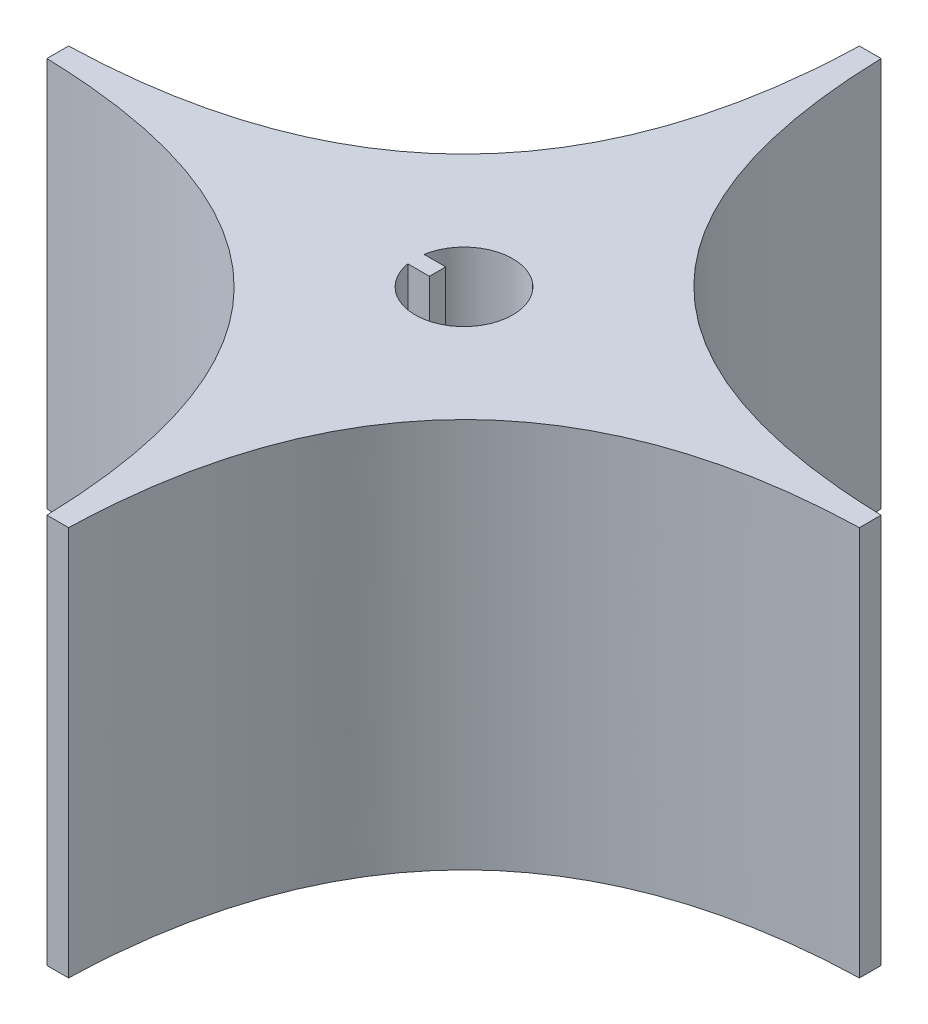
ISO-10303-21;
HEADER;
FILE_DESCRIPTION(('STEP AP214'),'2;1');
FILE_NAME('part.step','',(''),(''),'','','');
FILE_SCHEMA(('AUTOMOTIVE_DESIGN { 1 0 10303 214 1 1 1 1 }'));
ENDSEC;
DATA;
#1=APPLICATION_CONTEXT('core data for automotive mechanical design processes');
#2=APPLICATION_PROTOCOL_DEFINITION('international standard','automotive_design',2000,#1);
#3=PRODUCT_CONTEXT('',#1,'mechanical');
#4=PRODUCT('Part','Part','',(#3));
#5=PRODUCT_RELATED_PRODUCT_CATEGORY('part','',(#4));
#6=PRODUCT_DEFINITION_FORMATION('','',#4);
#7=PRODUCT_DEFINITION_CONTEXT('part definition',#1,'design');
#8=PRODUCT_DEFINITION('design','',#6,#7);
#9=PRODUCT_DEFINITION_SHAPE('','',#8);
#10=(LENGTH_UNIT() NAMED_UNIT(*) SI_UNIT(.MILLI.,.METRE.));
#11=(NAMED_UNIT(*) PLANE_ANGLE_UNIT() SI_UNIT($,.RADIAN.));
#12=(NAMED_UNIT(*) SI_UNIT($,.STERADIAN.) SOLID_ANGLE_UNIT());
#13=UNCERTAINTY_MEASURE_WITH_UNIT(LENGTH_MEASURE(1.E-05),#10,'distance_accuracy_value','');
#14=(GEOMETRIC_REPRESENTATION_CONTEXT(3) GLOBAL_UNCERTAINTY_ASSIGNED_CONTEXT((#13)) GLOBAL_UNIT_ASSIGNED_CONTEXT((#10,
#11,#12)) REPRESENTATION_CONTEXT('',''));
#15=CARTESIAN_POINT('',(0.,0.,0.));
#16=DIRECTION('',(0.,0.,1.));
#17=DIRECTION('',(1.,0.,0.));
#18=AXIS2_PLACEMENT_3D('',#15,#16,#17);
#19=CARTESIAN_POINT('',(0.,-18.,0.));
#20=DIRECTION('',(0.,-1.,0.));
#21=DIRECTION('',(0.,0.,-1.));
#22=AXIS2_PLACEMENT_3D('',#19,#20,#21);
#23=PLANE('',#22);
#24=CARTESIAN_POINT('',(0.,-18.,1.));
#25=DIRECTION('',(0.,-1.,0.));
#26=DIRECTION('',(0.,0.,-1.));
#27=AXIS2_PLACEMENT_3D('',#24,#25,#26);
#28=CIRCLE('',#27,4.50000000000001);
#29=CARTESIAN_POINT('',(-4.43738740323876,-18.,0.251940487943627));
#30=VERTEX_POINT('',#29);
#31=CARTESIAN_POINT('',(-4.43673139851751,-18.,1.75194048794363));
#32=VERTEX_POINT('',#31);
#33=EDGE_CURVE('E49',#30,#32,#28,.T.);
#34=ORIENTED_EDGE('',*,*,#33,.F.);
#35=DIRECTION('',(-1.,0.,0.));
#36=VECTOR('',#35,1.);
#37=CARTESIAN_POINT('',(-4.43738740323876,-18.,0.251940487943627));
#38=LINE('',#37,#36);
#39=CARTESIAN_POINT('',(-2.43673139851751,-18.,0.251940487943627));
#40=VERTEX_POINT('',#39);
#41=EDGE_CURVE('E235',#40,#30,#38,.T.);
#42=ORIENTED_EDGE('',*,*,#41,.F.);
#43=DIRECTION('',(0.,0.,-1.));
#44=VECTOR('',#43,1.);
#45=CARTESIAN_POINT('',(-2.43673139851751,-18.,1.75194048794363));
#46=LINE('',#45,#44);
#47=CARTESIAN_POINT('',(-2.43673139851751,-18.,1.75194048794363));
#48=VERTEX_POINT('',#47);
#49=EDGE_CURVE('E249',#48,#40,#46,.T.);
#50=ORIENTED_EDGE('',*,*,#49,.F.);
#51=DIRECTION('',(1.,0.,0.));
#52=VECTOR('',#51,1.);
#53=CARTESIAN_POINT('',(-4.43673139851751,-18.,1.75194048794363));
#54=LINE('',#53,#52);
#55=EDGE_CURVE('E246',#32,#48,#54,.T.);
#56=ORIENTED_EDGE('',*,*,#55,.F.);
#57=EDGE_LOOP('',(#34,#42,#50,#56));
#58=FACE_BOUND('',#57,.T.);
#59=DIRECTION('',(0.,0.,-1.));
#60=VECTOR('',#59,1.);
#61=CARTESIAN_POINT('',(37.5,-18.,2.));
#62=LINE('',#61,#60);
#63=CARTESIAN_POINT('',(37.5,-18.,2.));
#64=VERTEX_POINT('',#63);
#65=CARTESIAN_POINT('',(37.5,-18.,0.));
#66=VERTEX_POINT('',#65);
#67=EDGE_CURVE('E264',#64,#66,#62,.T.);
#68=ORIENTED_EDGE('',*,*,#67,.F.);
#69=CARTESIAN_POINT('',(37.5,-18.,2.));
#70=CARTESIAN_POINT('',(1.96320343559642,-18.,2.96320343559642));
#71=CARTESIAN_POINT('',(1.,-18.,38.5));
#72=B_SPLINE_CURVE_WITH_KNOTS('',2,(#69,#70,#71),.UNSPECIFIED.,.F.,.F.,(3,3),(0.,1.),.UNSPECIFIED.);
#73=CARTESIAN_POINT('',(1.,-18.,38.5));
#74=VERTEX_POINT('',#73);
#75=EDGE_CURVE('E11',#64,#74,#72,.T.);
#76=ORIENTED_EDGE('',*,*,#75,.T.);
#77=DIRECTION('',(1.,0.,0.));
#78=VECTOR('',#77,1.);
#79=CARTESIAN_POINT('',(-1.,-18.,38.5));
#80=LINE('',#79,#78);
#81=CARTESIAN_POINT('',(-1.,-18.,38.5));
#82=VERTEX_POINT('',#81);
#83=EDGE_CURVE('E278',#82,#74,#80,.T.);
#84=ORIENTED_EDGE('',*,*,#83,.F.);
#85=CARTESIAN_POINT('',(-1.,-18.,38.5));
#86=CARTESIAN_POINT('',(-1.96320343559643,-18.,2.96320343559643));
#87=CARTESIAN_POINT('',(-37.5,-18.,2.));
#88=B_SPLINE_CURVE_WITH_KNOTS('',2,(#85,#86,#87),.UNSPECIFIED.,.F.,.F.,(3,3),(0.,1.),.UNSPECIFIED.);
#89=CARTESIAN_POINT('',(-37.5,-18.,2.));
#90=VERTEX_POINT('',#89);
#91=EDGE_CURVE('E285',#82,#90,#88,.T.);
#92=ORIENTED_EDGE('',*,*,#91,.T.);
#93=DIRECTION('',(0.,0.,-1.));
#94=VECTOR('',#93,1.);
#95=CARTESIAN_POINT('',(-37.5,-18.,2.));
#96=LINE('',#95,#94);
#97=CARTESIAN_POINT('',(-37.5,-18.,0.));
#98=VERTEX_POINT('',#97);
#99=EDGE_CURVE('E256',#90,#98,#96,.T.);
#100=ORIENTED_EDGE('',*,*,#99,.T.);
#101=CARTESIAN_POINT('',(-37.5,-18.,0.));
#102=CARTESIAN_POINT('',(-1.96320343559643,-18.,-0.963203435596428));
#103=CARTESIAN_POINT('',(-1.,-18.,-36.5));
#104=B_SPLINE_CURVE_WITH_KNOTS('',2,(#101,#102,#103),.UNSPECIFIED.,.F.,.F.,(3,3),(0.,1.),.UNSPECIFIED.);
#105=CARTESIAN_POINT('',(-1.,-18.,-36.5));
#106=VERTEX_POINT('',#105);
#107=EDGE_CURVE('E290',#98,#106,#104,.T.);
#108=ORIENTED_EDGE('',*,*,#107,.T.);
#109=DIRECTION('',(1.,0.,0.));
#110=VECTOR('',#109,1.);
#111=CARTESIAN_POINT('',(-1.,-18.,-36.5));
#112=LINE('',#111,#110);
#113=CARTESIAN_POINT('',(1.,-18.,-36.5));
#114=VERTEX_POINT('',#113);
#115=EDGE_CURVE('E283',#106,#114,#112,.T.);
#116=ORIENTED_EDGE('',*,*,#115,.T.);
#117=CARTESIAN_POINT('',(1.,-18.,-36.5));
#118=CARTESIAN_POINT('',(1.96320343559642,-18.,-0.96320343559642));
#119=CARTESIAN_POINT('',(37.5,-18.,0.));
#120=B_SPLINE_CURVE_WITH_KNOTS('',2,(#117,#118,#119),.UNSPECIFIED.,.F.,.F.,(3,3),(0.,1.),.UNSPECIFIED.);
#121=EDGE_CURVE('E42',#114,#66,#120,.T.);
#122=ORIENTED_EDGE('',*,*,#121,.T.);
#123=EDGE_LOOP('',(#68,#76,#84,#92,#100,#108,#116,#122));
#124=FACE_BOUND('',#123,.T.);
#125=ADVANCED_FACE('F32',(#58,#124),#23,.T.);
#126=CARTESIAN_POINT('',(37.5,18.,2.));
#127=DIRECTION('',(-1.,0.,0.));
#128=DIRECTION('',(0.,-1.,0.));
#129=AXIS2_PLACEMENT_3D('',#126,#127,#128);
#130=PLANE('',#129);
#131=DIRECTION('',(0.,1.,0.));
#132=VECTOR('',#131,1.);
#133=CARTESIAN_POINT('',(37.5,18.,0.));
#134=LINE('',#133,#132);
#135=CARTESIAN_POINT('',(37.5,18.,0.));
#136=VERTEX_POINT('',#135);
#137=EDGE_CURVE('E269',#66,#136,#134,.T.);
#138=ORIENTED_EDGE('',*,*,#137,.T.);
#139=DIRECTION('',(0.,0.,-1.));
#140=VECTOR('',#139,1.);
#141=CARTESIAN_POINT('',(37.5,18.,2.));
#142=LINE('',#141,#140);
#143=CARTESIAN_POINT('',(37.5,18.,2.));
#144=VERTEX_POINT('',#143);
#145=EDGE_CURVE('E191',#144,#136,#142,.T.);
#146=ORIENTED_EDGE('',*,*,#145,.F.);
#147=DIRECTION('',(0.,1.,0.));
#148=VECTOR('',#147,1.);
#149=CARTESIAN_POINT('',(37.5,18.,2.));
#150=LINE('',#149,#148);
#151=EDGE_CURVE('E270',#64,#144,#150,.T.);
#152=ORIENTED_EDGE('',*,*,#151,.F.);
#153=ORIENTED_EDGE('',*,*,#67,.T.);
#154=EDGE_LOOP('',(#138,#146,#152,#153));
#155=FACE_BOUND('',#154,.T.);
#156=ADVANCED_FACE('F359',(#155),#130,.F.);
#157=CARTESIAN_POINT('',(-37.5,18.,2.));
#158=DIRECTION('',(1.,0.,0.));
#159=DIRECTION('',(0.,1.,0.));
#160=AXIS2_PLACEMENT_3D('',#157,#158,#159);
#161=PLANE('',#160);
#162=DIRECTION('',(0.,-1.,0.));
#163=VECTOR('',#162,1.);
#164=CARTESIAN_POINT('',(-37.5,18.,2.));
#165=LINE('',#164,#163);
#166=CARTESIAN_POINT('',(-37.5,18.,2.));
#167=VERTEX_POINT('',#166);
#168=EDGE_CURVE('E266',#167,#90,#165,.T.);
#169=ORIENTED_EDGE('',*,*,#168,.F.);
#170=DIRECTION('',(0.,0.,-1.));
#171=VECTOR('',#170,1.);
#172=CARTESIAN_POINT('',(-37.5,18.,2.));
#173=LINE('',#172,#171);
#174=CARTESIAN_POINT('',(-37.5,18.,0.));
#175=VERTEX_POINT('',#174);
#176=EDGE_CURVE('E185',#167,#175,#173,.T.);
#177=ORIENTED_EDGE('',*,*,#176,.T.);
#178=DIRECTION('',(0.,-1.,0.));
#179=VECTOR('',#178,1.);
#180=CARTESIAN_POINT('',(-37.5,18.,0.));
#181=LINE('',#180,#179);
#182=EDGE_CURVE('E267',#175,#98,#181,.T.);
#183=ORIENTED_EDGE('',*,*,#182,.T.);
#184=ORIENTED_EDGE('',*,*,#99,.F.);
#185=EDGE_LOOP('',(#169,#177,#183,#184));
#186=FACE_BOUND('',#185,.T.);
#187=ADVANCED_FACE('F372',(#186),#161,.F.);
#188=CARTESIAN_POINT('',(0.,0.,-36.5));
#189=DIRECTION('',(0.,0.,1.));
#190=DIRECTION('',(1.,0.,0.));
#191=AXIS2_PLACEMENT_3D('',#188,#189,#190);
#192=PLANE('',#191);
#193=DIRECTION('',(0.,1.,0.));
#194=VECTOR('',#193,1.);
#195=CARTESIAN_POINT('',(-1.,-18.,-36.5));
#196=LINE('',#195,#194);
#197=CARTESIAN_POINT('',(-1.00000000000001,18.,-36.5));
#198=VERTEX_POINT('',#197);
#199=EDGE_CURVE('E280',#106,#198,#196,.T.);
#200=ORIENTED_EDGE('',*,*,#199,.T.);
#201=DIRECTION('',(1.,0.,0.));
#202=VECTOR('',#201,1.);
#203=CARTESIAN_POINT('',(-1.00000000000001,18.,-36.5));
#204=LINE('',#203,#202);
#205=CARTESIAN_POINT('',(0.999999999999986,18.,-36.5));
#206=VERTEX_POINT('',#205);
#207=EDGE_CURVE('E197',#198,#206,#204,.T.);
#208=ORIENTED_EDGE('',*,*,#207,.T.);
#209=DIRECTION('',(0.,1.,0.));
#210=VECTOR('',#209,1.);
#211=CARTESIAN_POINT('',(1.,-18.,-36.5));
#212=LINE('',#211,#210);
#213=EDGE_CURVE('E57',#114,#206,#212,.T.);
#214=ORIENTED_EDGE('',*,*,#213,.F.);
#215=ORIENTED_EDGE('',*,*,#115,.F.);
#216=EDGE_LOOP('',(#200,#208,#214,#215));
#217=FACE_BOUND('',#216,.T.);
#218=ADVANCED_FACE('F312',(#217),#192,.F.);
#219=CARTESIAN_POINT('',(0.,0.,38.5));
#220=DIRECTION('',(0.,0.,1.));
#221=DIRECTION('',(1.,0.,0.));
#222=AXIS2_PLACEMENT_3D('',#219,#220,#221);
#223=PLANE('',#222);
#224=DIRECTION('',(0.,1.,0.));
#225=VECTOR('',#224,1.);
#226=CARTESIAN_POINT('',(1.,-18.,38.5));
#227=LINE('',#226,#225);
#228=CARTESIAN_POINT('',(0.999999999999986,18.,38.5));
#229=VERTEX_POINT('',#228);
#230=EDGE_CURVE('E276',#74,#229,#227,.T.);
#231=ORIENTED_EDGE('',*,*,#230,.T.);
#232=DIRECTION('',(1.,0.,0.));
#233=VECTOR('',#232,1.);
#234=CARTESIAN_POINT('',(-1.00000000000001,18.,38.5));
#235=LINE('',#234,#233);
#236=CARTESIAN_POINT('',(-1.00000000000001,18.,38.5));
#237=VERTEX_POINT('',#236);
#238=EDGE_CURVE('E194',#237,#229,#235,.T.);
#239=ORIENTED_EDGE('',*,*,#238,.F.);
#240=DIRECTION('',(0.,1.,0.));
#241=VECTOR('',#240,1.);
#242=CARTESIAN_POINT('',(-1.,-18.,38.5));
#243=LINE('',#242,#241);
#244=EDGE_CURVE('E272',#82,#237,#243,.T.);
#245=ORIENTED_EDGE('',*,*,#244,.F.);
#246=ORIENTED_EDGE('',*,*,#83,.T.);
#247=EDGE_LOOP('',(#231,#239,#245,#246));
#248=FACE_BOUND('',#247,.T.);
#249=ADVANCED_FACE('F310',(#248),#223,.T.);
#250=CARTESIAN_POINT('',(-1.,18.,38.5));
#251=CARTESIAN_POINT('',(-1.96320343559643,18.,2.96320343559643));
#252=CARTESIAN_POINT('',(-37.5,18.,2.));
#253=B_SPLINE_CURVE_WITH_KNOTS('',2,(#250,#251,#252),.UNSPECIFIED.,.F.,.F.,(3,3),(0.,1.),.UNSPECIFIED.);
#254=DIRECTION('',(0.,-1.,0.));
#255=VECTOR('',#254,1.);
#256=SURFACE_OF_LINEAR_EXTRUSION('',#253,#255);
#257=ORIENTED_EDGE('',*,*,#244,.T.);
#258=CARTESIAN_POINT('',(-1.00000000000001,18.,38.5));
#259=CARTESIAN_POINT('',(-1.96320343559644,18.,2.96320343559643));
#260=CARTESIAN_POINT('',(-37.5,18.,2.));
#261=B_SPLINE_CURVE_WITH_KNOTS('',2,(#258,#259,#260),.UNSPECIFIED.,.F.,.F.,(3,3),(0.,1.),.UNSPECIFIED.);
#262=EDGE_CURVE('E199',#237,#167,#261,.T.);
#263=ORIENTED_EDGE('',*,*,#262,.T.);
#264=ORIENTED_EDGE('',*,*,#168,.T.);
#265=ORIENTED_EDGE('',*,*,#91,.F.);
#266=EDGE_LOOP('',(#257,#263,#264,#265));
#267=FACE_BOUND('',#266,.T.);
#268=ADVANCED_FACE('F305',(#267),#256,.T.);
#269=CARTESIAN_POINT('',(-37.5,18.,0.));
#270=CARTESIAN_POINT('',(-1.96320343559643,18.,-0.963203435596428));
#271=CARTESIAN_POINT('',(-1.,18.,-36.5));
#272=B_SPLINE_CURVE_WITH_KNOTS('',2,(#269,#270,#271),.UNSPECIFIED.,.F.,.F.,(3,3),(0.,1.),.UNSPECIFIED.);
#273=DIRECTION('',(0.,-1.,0.));
#274=VECTOR('',#273,1.);
#275=SURFACE_OF_LINEAR_EXTRUSION('',#272,#274);
#276=ORIENTED_EDGE('',*,*,#182,.F.);
#277=CARTESIAN_POINT('',(-37.5,18.,0.));
#278=CARTESIAN_POINT('',(-1.96320343559644,18.,-0.963203435596428));
#279=CARTESIAN_POINT('',(-1.00000000000001,18.,-36.5));
#280=B_SPLINE_CURVE_WITH_KNOTS('',2,(#277,#278,#279),.UNSPECIFIED.,.F.,.F.,(3,3),(0.,1.),.UNSPECIFIED.);
#281=EDGE_CURVE('E204',#175,#198,#280,.T.);
#282=ORIENTED_EDGE('',*,*,#281,.T.);
#283=ORIENTED_EDGE('',*,*,#199,.F.);
#284=ORIENTED_EDGE('',*,*,#107,.F.);
#285=EDGE_LOOP('',(#276,#282,#283,#284));
#286=FACE_BOUND('',#285,.T.);
#287=ADVANCED_FACE('F309',(#286),#275,.T.);
#288=CARTESIAN_POINT('',(1.,18.,-36.5));
#289=CARTESIAN_POINT('',(1.96320343559642,18.,-0.96320343559642));
#290=CARTESIAN_POINT('',(37.5,18.,0.));
#291=B_SPLINE_CURVE_WITH_KNOTS('',2,(#288,#289,#290),.UNSPECIFIED.,.F.,.F.,(3,3),(0.,1.),.UNSPECIFIED.);
#292=DIRECTION('',(0.,-1.,0.));
#293=VECTOR('',#292,1.);
#294=SURFACE_OF_LINEAR_EXTRUSION('',#291,#293);
#295=ORIENTED_EDGE('',*,*,#213,.T.);
#296=CARTESIAN_POINT('',(0.999999999999986,18.,-36.5));
#297=CARTESIAN_POINT('',(1.96320343559641,18.,-0.96320343559642));
#298=CARTESIAN_POINT('',(37.5,18.,0.));
#299=B_SPLINE_CURVE_WITH_KNOTS('',2,(#296,#297,#298),.UNSPECIFIED.,.F.,.F.,(3,3),(0.,1.),.UNSPECIFIED.);
#300=EDGE_CURVE('E212',#206,#136,#299,.T.);
#301=ORIENTED_EDGE('',*,*,#300,.T.);
#302=ORIENTED_EDGE('',*,*,#137,.F.);
#303=ORIENTED_EDGE('',*,*,#121,.F.);
#304=EDGE_LOOP('',(#295,#301,#302,#303));
#305=FACE_BOUND('',#304,.T.);
#306=ADVANCED_FACE('F316',(#305),#294,.T.);
#307=CARTESIAN_POINT('',(37.5,18.,2.));
#308=CARTESIAN_POINT('',(1.96320343559642,18.,2.96320343559642));
#309=CARTESIAN_POINT('',(1.,18.,38.5));
#310=B_SPLINE_CURVE_WITH_KNOTS('',2,(#307,#308,#309),.UNSPECIFIED.,.F.,.F.,(3,3),(0.,1.),.UNSPECIFIED.);
#311=DIRECTION('',(0.,-1.,0.));
#312=VECTOR('',#311,1.);
#313=SURFACE_OF_LINEAR_EXTRUSION('',#310,#312);
#314=ORIENTED_EDGE('',*,*,#151,.T.);
#315=CARTESIAN_POINT('',(37.5,18.,2.));
#316=CARTESIAN_POINT('',(1.96320343559641,18.,2.96320343559642));
#317=CARTESIAN_POINT('',(0.999999999999986,18.,38.5));
#318=B_SPLINE_CURVE_WITH_KNOTS('',2,(#315,#316,#317),.UNSPECIFIED.,.F.,.F.,(3,3),(0.,1.),.UNSPECIFIED.);
#319=EDGE_CURVE('E220',#144,#229,#318,.T.);
#320=ORIENTED_EDGE('',*,*,#319,.T.);
#321=ORIENTED_EDGE('',*,*,#230,.F.);
#322=ORIENTED_EDGE('',*,*,#75,.F.);
#323=EDGE_LOOP('',(#314,#320,#321,#322));
#324=FACE_BOUND('',#323,.T.);
#325=ADVANCED_FACE('F365',(#324),#313,.T.);
#326=CARTESIAN_POINT('',(0.,-8.,1.));
#327=DIRECTION('',(0.,-1.,0.));
#328=DIRECTION('',(0.,0.,-1.));
#329=AXIS2_PLACEMENT_3D('',#326,#327,#328);
#330=CYLINDRICAL_SURFACE('',#329,4.50000000000001);
#331=ORIENTED_EDGE('',*,*,#33,.T.);
#332=DIRECTION('',(0.,-1.,0.));
#333=VECTOR('',#332,1.);
#334=CARTESIAN_POINT('',(-4.43673139851751,-8.,1.75194048794363));
#335=LINE('',#334,#333);
#336=CARTESIAN_POINT('',(-4.43673139851751,-8.,1.75194048794363));
#337=VERTEX_POINT('',#336);
#338=EDGE_CURVE('E244',#337,#32,#335,.T.);
#339=ORIENTED_EDGE('',*,*,#338,.F.);
#340=CARTESIAN_POINT('',(0.,-8.,1.));
#341=DIRECTION('',(0.,-1.,0.));
#342=DIRECTION('',(0.,0.,-1.));
#343=AXIS2_PLACEMENT_3D('',#340,#341,#342);
#344=CIRCLE('',#343,4.50000000000001);
#345=CARTESIAN_POINT('',(-4.43738740323876,-8.,0.251940487943627));
#346=VERTEX_POINT('',#345);
#347=EDGE_CURVE('E228',#346,#337,#344,.T.);
#348=ORIENTED_EDGE('',*,*,#347,.F.);
#349=DIRECTION('',(0.,-1.,0.));
#350=VECTOR('',#349,1.);
#351=CARTESIAN_POINT('',(-4.43738740323876,-8.,0.251940487943627));
#352=LINE('',#351,#350);
#353=EDGE_CURVE('E254',#346,#30,#352,.T.);
#354=ORIENTED_EDGE('',*,*,#353,.T.);
#355=EDGE_LOOP('',(#331,#339,#348,#354));
#356=FACE_BOUND('',#355,.T.);
#357=ADVANCED_FACE('F405',(#356),#330,.F.);
#358=CARTESIAN_POINT('',(-4.43738740323876,-8.,0.251940487943627));
#359=DIRECTION('',(0.,0.,1.));
#360=DIRECTION('',(1.,0.,0.));
#361=AXIS2_PLACEMENT_3D('',#358,#359,#360);
#362=PLANE('',#361);
#363=ORIENTED_EDGE('',*,*,#41,.T.);
#364=ORIENTED_EDGE('',*,*,#353,.F.);
#365=DIRECTION('',(-1.,0.,0.));
#366=VECTOR('',#365,1.);
#367=CARTESIAN_POINT('',(-4.43738740323876,-8.,0.251940487943627));
#368=LINE('',#367,#366);
#369=CARTESIAN_POINT('',(-2.43673139851751,-8.,0.251940487943627));
#370=VERTEX_POINT('',#369);
#371=EDGE_CURVE('E241',#370,#346,#368,.T.);
#372=ORIENTED_EDGE('',*,*,#371,.F.);
#373=DIRECTION('',(0.,-1.,0.));
#374=VECTOR('',#373,1.);
#375=CARTESIAN_POINT('',(-2.43673139851751,-8.,0.251940487943627));
#376=LINE('',#375,#374);
#377=EDGE_CURVE('E257',#370,#40,#376,.T.);
#378=ORIENTED_EDGE('',*,*,#377,.T.);
#379=EDGE_LOOP('',(#363,#364,#372,#378));
#380=FACE_BOUND('',#379,.T.);
#381=ADVANCED_FACE('F412',(#380),#362,.F.);
#382=CARTESIAN_POINT('',(-2.43673139851751,-8.,1.75194048794363));
#383=DIRECTION('',(-1.,0.,0.));
#384=DIRECTION('',(0.,0.,1.));
#385=AXIS2_PLACEMENT_3D('',#382,#383,#384);
#386=PLANE('',#385);
#387=ORIENTED_EDGE('',*,*,#49,.T.);
#388=ORIENTED_EDGE('',*,*,#377,.F.);
#389=DIRECTION('',(0.,0.,-1.));
#390=VECTOR('',#389,1.);
#391=CARTESIAN_POINT('',(-2.43673139851751,-8.,1.75194048794363));
#392=LINE('',#391,#390);
#393=CARTESIAN_POINT('',(-2.43673139851751,-8.,1.75194048794363));
#394=VERTEX_POINT('',#393);
#395=EDGE_CURVE('E238',#394,#370,#392,.T.);
#396=ORIENTED_EDGE('',*,*,#395,.F.);
#397=DIRECTION('',(0.,-1.,0.));
#398=VECTOR('',#397,1.);
#399=CARTESIAN_POINT('',(-2.43673139851751,-8.,1.75194048794363));
#400=LINE('',#399,#398);
#401=EDGE_CURVE('E259',#394,#48,#400,.T.);
#402=ORIENTED_EDGE('',*,*,#401,.T.);
#403=EDGE_LOOP('',(#387,#388,#396,#402));
#404=FACE_BOUND('',#403,.T.);
#405=ADVANCED_FACE('F421',(#404),#386,.F.);
#406=CARTESIAN_POINT('',(-4.43673139851751,-8.,1.75194048794363));
#407=DIRECTION('',(0.,0.,-1.));
#408=DIRECTION('',(-1.,0.,0.));
#409=AXIS2_PLACEMENT_3D('',#406,#407,#408);
#410=PLANE('',#409);
#411=ORIENTED_EDGE('',*,*,#55,.T.);
#412=ORIENTED_EDGE('',*,*,#401,.F.);
#413=DIRECTION('',(1.,0.,0.));
#414=VECTOR('',#413,1.);
#415=CARTESIAN_POINT('',(-4.43673139851751,-8.,1.75194048794363));
#416=LINE('',#415,#414);
#417=EDGE_CURVE('E234',#337,#394,#416,.T.);
#418=ORIENTED_EDGE('',*,*,#417,.F.);
#419=ORIENTED_EDGE('',*,*,#338,.T.);
#420=EDGE_LOOP('',(#411,#412,#418,#419));
#421=FACE_BOUND('',#420,.T.);
#422=ADVANCED_FACE('F431',(#421),#410,.F.);
#423=CARTESIAN_POINT('',(0.,-8.,1.));
#424=DIRECTION('',(0.,-1.,0.));
#425=DIRECTION('',(0.,0.,-1.));
#426=AXIS2_PLACEMENT_3D('',#423,#424,#425);
#427=PLANE('',#426);
#428=ORIENTED_EDGE('',*,*,#347,.T.);
#429=ORIENTED_EDGE('',*,*,#417,.T.);
#430=ORIENTED_EDGE('',*,*,#395,.T.);
#431=ORIENTED_EDGE('',*,*,#371,.T.);
#432=EDGE_LOOP('',(#428,#429,#430,#431));
#433=FACE_BOUND('',#432,.T.);
#434=ADVANCED_FACE('F440',(#433),#427,.T.);
#435=CARTESIAN_POINT('',(0.,18.,0.));
#436=DIRECTION('',(0.,1.,0.));
#437=DIRECTION('',(0.,0.,-1.));
#438=AXIS2_PLACEMENT_3D('',#435,#436,#437);
#439=PLANE('',#438);
#440=CARTESIAN_POINT('',(0.,18.,1.));
#441=DIRECTION('',(0.,-1.,0.));
#442=DIRECTION('',(0.,0.,-1.));
#443=AXIS2_PLACEMENT_3D('',#440,#441,#442);
#444=CIRCLE('',#443,4.50000000000001);
#445=CARTESIAN_POINT('',(-4.43738740323878,18.,0.251940487943627));
#446=VERTEX_POINT('',#445);
#447=CARTESIAN_POINT('',(-4.43673139851753,18.,1.75194048794363));
#448=VERTEX_POINT('',#447);
#449=EDGE_CURVE('E179',#446,#448,#444,.T.);
#450=ORIENTED_EDGE('',*,*,#449,.T.);
#451=DIRECTION('',(1.,0.,0.));
#452=VECTOR('',#451,1.);
#453=CARTESIAN_POINT('',(-4.43673139851753,18.,1.75194048794363));
#454=LINE('',#453,#452);
#455=CARTESIAN_POINT('',(-2.43673139851753,18.,1.75194048794363));
#456=VERTEX_POINT('',#455);
#457=EDGE_CURVE('E162',#448,#456,#454,.T.);
#458=ORIENTED_EDGE('',*,*,#457,.T.);
#459=DIRECTION('',(0.,0.,-1.));
#460=VECTOR('',#459,1.);
#461=CARTESIAN_POINT('',(-2.43673139851753,18.,1.75194048794363));
#462=LINE('',#461,#460);
#463=CARTESIAN_POINT('',(-2.43673139851753,18.,0.251940487943627));
#464=VERTEX_POINT('',#463);
#465=EDGE_CURVE('E174',#456,#464,#462,.T.);
#466=ORIENTED_EDGE('',*,*,#465,.T.);
#467=DIRECTION('',(-1.,0.,0.));
#468=VECTOR('',#467,1.);
#469=CARTESIAN_POINT('',(-4.43738740323878,18.,0.251940487943627));
#470=LINE('',#469,#468);
#471=EDGE_CURVE('E171',#464,#446,#470,.T.);
#472=ORIENTED_EDGE('',*,*,#471,.T.);
#473=EDGE_LOOP('',(#450,#458,#466,#472));
#474=FACE_BOUND('',#473,.T.);
#475=ORIENTED_EDGE('',*,*,#145,.T.);
#476=ORIENTED_EDGE('',*,*,#300,.F.);
#477=ORIENTED_EDGE('',*,*,#207,.F.);
#478=ORIENTED_EDGE('',*,*,#281,.F.);
#479=ORIENTED_EDGE('',*,*,#176,.F.);
#480=ORIENTED_EDGE('',*,*,#262,.F.);
#481=ORIENTED_EDGE('',*,*,#238,.T.);
#482=ORIENTED_EDGE('',*,*,#319,.F.);
#483=EDGE_LOOP('',(#475,#476,#477,#478,#479,#480,#481,#482));
#484=FACE_BOUND('',#483,.T.);
#485=ADVANCED_FACE('F353',(#474,#484),#439,.T.);
#486=CARTESIAN_POINT('',(0.,8.,1.));
#487=DIRECTION('',(0.,1.,0.));
#488=DIRECTION('',(0.,0.,-1.));
#489=AXIS2_PLACEMENT_3D('',#486,#487,#488);
#490=CYLINDRICAL_SURFACE('',#489,4.50000000000001);
#491=ORIENTED_EDGE('',*,*,#449,.F.);
#492=DIRECTION('',(0.,1.,0.));
#493=VECTOR('',#492,1.);
#494=CARTESIAN_POINT('',(-4.43738740323877,8.,0.251940487943627));
#495=LINE('',#494,#493);
#496=CARTESIAN_POINT('',(-4.43738740323877,8.,0.251940487943627));
#497=VERTEX_POINT('',#496);
#498=EDGE_CURVE('E170',#497,#446,#495,.T.);
#499=ORIENTED_EDGE('',*,*,#498,.F.);
#500=CARTESIAN_POINT('',(0.,8.,1.));
#501=DIRECTION('',(0.,-1.,0.));
#502=DIRECTION('',(0.,0.,-1.));
#503=AXIS2_PLACEMENT_3D('',#500,#501,#502);
#504=CIRCLE('',#503,4.50000000000001);
#505=CARTESIAN_POINT('',(-4.43673139851752,8.,1.75194048794363));
#506=VERTEX_POINT('',#505);
#507=EDGE_CURVE('E152',#497,#506,#504,.T.);
#508=ORIENTED_EDGE('',*,*,#507,.T.);
#509=DIRECTION('',(0.,1.,0.));
#510=VECTOR('',#509,1.);
#511=CARTESIAN_POINT('',(-4.43673139851752,8.,1.75194048794363));
#512=LINE('',#511,#510);
#513=EDGE_CURVE('E159',#506,#448,#512,.T.);
#514=ORIENTED_EDGE('',*,*,#513,.T.);
#515=EDGE_LOOP('',(#491,#499,#508,#514));
#516=FACE_BOUND('',#515,.T.);
#517=ADVANCED_FACE('F169',(#516),#490,.F.);
#518=CARTESIAN_POINT('',(-4.43738740323877,8.,0.251940487943627));
#519=DIRECTION('',(0.,0.,1.));
#520=DIRECTION('',(1.,0.,0.));
#521=AXIS2_PLACEMENT_3D('',#518,#519,#520);
#522=PLANE('',#521);
#523=ORIENTED_EDGE('',*,*,#471,.F.);
#524=DIRECTION('',(0.,1.,0.));
#525=VECTOR('',#524,1.);
#526=CARTESIAN_POINT('',(-2.43673139851752,8.,0.251940487943627));
#527=LINE('',#526,#525);
#528=CARTESIAN_POINT('',(-2.43673139851752,8.,0.251940487943627));
#529=VERTEX_POINT('',#528);
#530=EDGE_CURVE('E186',#529,#464,#527,.T.);
#531=ORIENTED_EDGE('',*,*,#530,.F.);
#532=DIRECTION('',(-1.,0.,0.));
#533=VECTOR('',#532,1.);
#534=CARTESIAN_POINT('',(-4.43738740323877,8.,0.251940487943627));
#535=LINE('',#534,#533);
#536=EDGE_CURVE('E167',#529,#497,#535,.T.);
#537=ORIENTED_EDGE('',*,*,#536,.T.);
#538=ORIENTED_EDGE('',*,*,#498,.T.);
#539=EDGE_LOOP('',(#523,#531,#537,#538));
#540=FACE_BOUND('',#539,.T.);
#541=ADVANCED_FACE('F464',(#540),#522,.F.);
#542=CARTESIAN_POINT('',(-2.43673139851752,8.,1.75194048794363));
#543=DIRECTION('',(-1.,0.,0.));
#544=DIRECTION('',(0.,0.,1.));
#545=AXIS2_PLACEMENT_3D('',#542,#543,#544);
#546=PLANE('',#545);
#547=ORIENTED_EDGE('',*,*,#465,.F.);
#548=DIRECTION('',(0.,1.,0.));
#549=VECTOR('',#548,1.);
#550=CARTESIAN_POINT('',(-2.43673139851752,8.,1.75194048794363));
#551=LINE('',#550,#549);
#552=CARTESIAN_POINT('',(-2.43673139851752,8.,1.75194048794363));
#553=VERTEX_POINT('',#552);
#554=EDGE_CURVE('E166',#553,#456,#551,.T.);
#555=ORIENTED_EDGE('',*,*,#554,.F.);
#556=DIRECTION('',(0.,0.,-1.));
#557=VECTOR('',#556,1.);
#558=CARTESIAN_POINT('',(-2.43673139851752,8.,1.75194048794363));
#559=LINE('',#558,#557);
#560=EDGE_CURVE('E154',#553,#529,#559,.T.);
#561=ORIENTED_EDGE('',*,*,#560,.T.);
#562=ORIENTED_EDGE('',*,*,#530,.T.);
#563=EDGE_LOOP('',(#547,#555,#561,#562));
#564=FACE_BOUND('',#563,.T.);
#565=ADVANCED_FACE('F471',(#564),#546,.F.);
#566=CARTESIAN_POINT('',(-4.43673139851752,8.,1.75194048794363));
#567=DIRECTION('',(0.,0.,-1.));
#568=DIRECTION('',(-1.,0.,0.));
#569=AXIS2_PLACEMENT_3D('',#566,#567,#568);
#570=PLANE('',#569);
#571=ORIENTED_EDGE('',*,*,#457,.F.);
#572=ORIENTED_EDGE('',*,*,#513,.F.);
#573=DIRECTION('',(1.,0.,0.));
#574=VECTOR('',#573,1.);
#575=CARTESIAN_POINT('',(-4.43673139851752,8.,1.75194048794363));
#576=LINE('',#575,#574);
#577=EDGE_CURVE('E147',#506,#553,#576,.T.);
#578=ORIENTED_EDGE('',*,*,#577,.T.);
#579=ORIENTED_EDGE('',*,*,#554,.T.);
#580=EDGE_LOOP('',(#571,#572,#578,#579));
#581=FACE_BOUND('',#580,.T.);
#582=ADVANCED_FACE('F160',(#581),#570,.F.);
#583=CARTESIAN_POINT('',(0.,8.,1.));
#584=DIRECTION('',(0.,1.,0.));
#585=DIRECTION('',(0.,0.,-1.));
#586=AXIS2_PLACEMENT_3D('',#583,#584,#585);
#587=PLANE('',#586);
#588=ORIENTED_EDGE('',*,*,#507,.F.);
#589=ORIENTED_EDGE('',*,*,#536,.F.);
#590=ORIENTED_EDGE('',*,*,#560,.F.);
#591=ORIENTED_EDGE('',*,*,#577,.F.);
#592=EDGE_LOOP('',(#588,#589,#590,#591));
#593=FACE_BOUND('',#592,.T.);
#594=ADVANCED_FACE('F149',(#593),#587,.T.);
#595=CLOSED_SHELL('',(#125,#156,#187,#218,#249,#268,#287,#306,#325,#357,#381,#405,#422,#434,
#485,#517,#541,#565,#582,#594));
#596=MANIFOLD_SOLID_BREP('B2',#595);
#597=ADVANCED_BREP_SHAPE_REPRESENTATION('',(#18,#596),#14);
#598=SHAPE_DEFINITION_REPRESENTATION(#9,#597);
ENDSEC;
END-ISO-10303-21;
